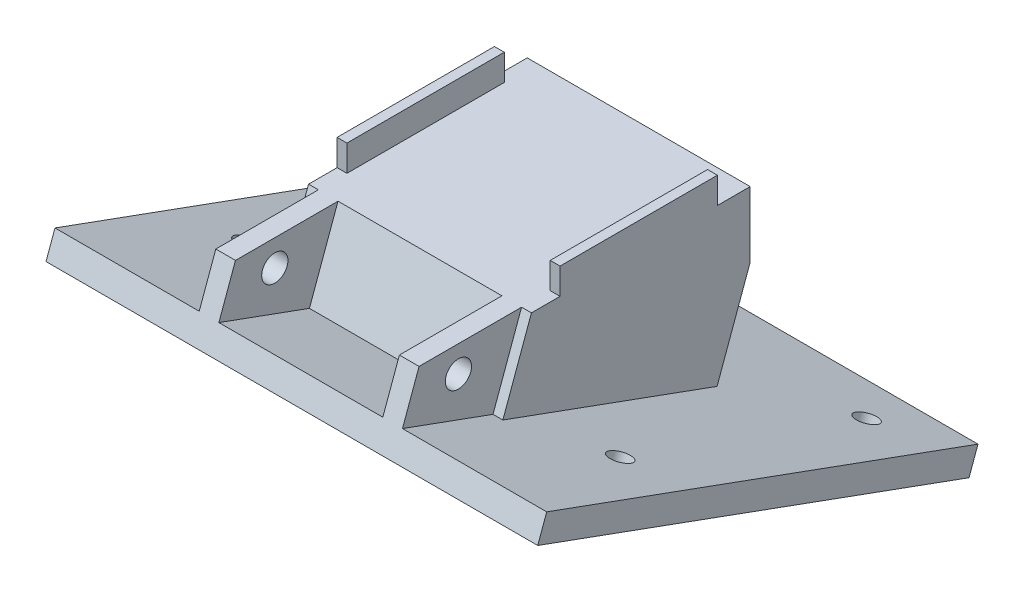
ISO-10303-21;
HEADER;
FILE_DESCRIPTION(('STEP AP214'),'2;1');
FILE_NAME('part.step','',(''),(''),'','','');
FILE_SCHEMA(('AUTOMOTIVE_DESIGN { 1 0 10303 214 1 1 1 1 }'));
ENDSEC;
DATA;
#1=APPLICATION_CONTEXT('core data for automotive mechanical design processes');
#2=APPLICATION_PROTOCOL_DEFINITION('international standard','automotive_design',2000,#1);
#3=PRODUCT_CONTEXT('',#1,'mechanical');
#4=PRODUCT('Part','Part','',(#3));
#5=PRODUCT_RELATED_PRODUCT_CATEGORY('part','',(#4));
#6=PRODUCT_DEFINITION_FORMATION('','',#4);
#7=PRODUCT_DEFINITION_CONTEXT('part definition',#1,'design');
#8=PRODUCT_DEFINITION('design','',#6,#7);
#9=PRODUCT_DEFINITION_SHAPE('','',#8);
#10=(LENGTH_UNIT() NAMED_UNIT(*) SI_UNIT(.MILLI.,.METRE.));
#11=(NAMED_UNIT(*) PLANE_ANGLE_UNIT() SI_UNIT($,.RADIAN.));
#12=(NAMED_UNIT(*) SI_UNIT($,.STERADIAN.) SOLID_ANGLE_UNIT());
#13=UNCERTAINTY_MEASURE_WITH_UNIT(LENGTH_MEASURE(1.E-05),#10,'distance_accuracy_value','');
#14=(GEOMETRIC_REPRESENTATION_CONTEXT(3) GLOBAL_UNCERTAINTY_ASSIGNED_CONTEXT((#13)) GLOBAL_UNIT_ASSIGNED_CONTEXT((#10,
#11,#12)) REPRESENTATION_CONTEXT('',''));
#15=CARTESIAN_POINT('',(0.,0.,0.));
#16=DIRECTION('',(0.,0.,1.));
#17=DIRECTION('',(1.,0.,0.));
#18=AXIS2_PLACEMENT_3D('',#15,#16,#17);
#19=CARTESIAN_POINT('',(-12.5,-28.1780056072107,24.5));
#20=DIRECTION('',(-1.,0.,0.));
#21=DIRECTION('',(0.,0.,1.));
#22=AXIS2_PLACEMENT_3D('',#19,#20,#21);
#23=PLANE('',#22);
#24=CARTESIAN_POINT('',(-12.5,6.,18.5));
#25=DIRECTION('',(-1.,0.,0.));
#26=DIRECTION('',(0.,0.,1.));
#27=AXIS2_PLACEMENT_3D('',#24,#25,#26);
#28=CIRCLE('',#27,2.);
#29=CARTESIAN_POINT('',(-12.5,6.,20.5));
#30=VERTEX_POINT('',#29);
#31=EDGE_CURVE('E307',#30,#30,#28,.T.);
#32=ORIENTED_EDGE('',*,*,#31,.T.);
#33=EDGE_LOOP('',(#32));
#34=FACE_BOUND('',#33,.T.);
#35=DIRECTION('',(0.,0.342020143325669,0.939692620785908));
#36=VECTOR('',#35,1.);
#37=CARTESIAN_POINT('',(-12.5,-1.41681525524397,14.7597232783522));
#38=LINE('',#37,#36);
#39=CARTESIAN_POINT('',(-12.5,-1.97734041654742,13.2196930546348));
#40=VERTEX_POINT('',#39);
#41=CARTESIAN_POINT('',(-12.5,3.04916302597692,27.0298977617813));
#42=VERTEX_POINT('',#41);
#43=EDGE_CURVE('E257',#40,#42,#38,.T.);
#44=ORIENTED_EDGE('',*,*,#43,.F.);
#45=DIRECTION('',(0.,-0.939692620785907,0.342020143325672));
#46=VECTOR('',#45,1.);
#47=CARTESIAN_POINT('',(-12.5,-3.85672565811916,13.9037333412861));
#48=LINE('',#47,#46);
#49=CARTESIAN_POINT('',(-12.5,10.,8.86029765733793));
#50=VERTEX_POINT('',#49);
#51=EDGE_CURVE('E269',#50,#40,#48,.T.);
#52=ORIENTED_EDGE('',*,*,#51,.F.);
#53=DIRECTION('',(0.,0.,1.));
#54=VECTOR('',#53,1.);
#55=CARTESIAN_POINT('',(-12.5,10.,24.5));
#56=LINE('',#55,#54);
#57=CARTESIAN_POINT('',(-12.5,10.,24.5));
#58=VERTEX_POINT('',#57);
#59=EDGE_CURVE('E310',#50,#58,#56,.T.);
#60=ORIENTED_EDGE('',*,*,#59,.T.);
#61=DIRECTION('',(0.,0.93969262078591,-0.342020143325663));
#62=VECTOR('',#61,1.);
#63=CARTESIAN_POINT('',(-12.5,10.,24.5));
#64=LINE('',#63,#62);
#65=EDGE_CURVE('E295',#42,#58,#64,.T.);
#66=ORIENTED_EDGE('',*,*,#65,.F.);
#67=EDGE_LOOP('',(#44,#52,#60,#66));
#68=FACE_BOUND('',#67,.T.);
#69=ADVANCED_FACE('F38',(#34,#68),#23,.F.);
#70=CARTESIAN_POINT('',(12.5,-28.1780056072107,24.5));
#71=DIRECTION('',(1.,0.,0.));
#72=DIRECTION('',(0.,0.,-1.));
#73=AXIS2_PLACEMENT_3D('',#70,#71,#72);
#74=PLANE('',#73);
#75=CARTESIAN_POINT('',(12.5,6.,18.5));
#76=DIRECTION('',(1.,0.,0.));
#77=DIRECTION('',(0.,0.,-1.));
#78=AXIS2_PLACEMENT_3D('',#75,#76,#77);
#79=CIRCLE('',#78,2.);
#80=CARTESIAN_POINT('',(12.5,6.,16.5));
#81=VERTEX_POINT('',#80);
#82=EDGE_CURVE('E304',#81,#81,#79,.T.);
#83=ORIENTED_EDGE('',*,*,#82,.T.);
#84=EDGE_LOOP('',(#83));
#85=FACE_BOUND('',#84,.T.);
#86=DIRECTION('',(0.,-0.342020143325669,-0.939692620785908));
#87=VECTOR('',#86,1.);
#88=CARTESIAN_POINT('',(12.5,-1.41681525524397,14.7597232783522));
#89=LINE('',#88,#87);
#90=CARTESIAN_POINT('',(12.5,3.04916302597692,27.0298977617813));
#91=VERTEX_POINT('',#90);
#92=CARTESIAN_POINT('',(12.5,-1.97734041654742,13.2196930546348));
#93=VERTEX_POINT('',#92);
#94=EDGE_CURVE('E255',#91,#93,#89,.T.);
#95=ORIENTED_EDGE('',*,*,#94,.F.);
#96=DIRECTION('',(0.,-0.93969262078591,0.342020143325663));
#97=VECTOR('',#96,1.);
#98=CARTESIAN_POINT('',(12.5,10.,24.5));
#99=LINE('',#98,#97);
#100=CARTESIAN_POINT('',(12.5,10.,24.5));
#101=VERTEX_POINT('',#100);
#102=EDGE_CURVE('E289',#101,#91,#99,.T.);
#103=ORIENTED_EDGE('',*,*,#102,.F.);
#104=DIRECTION('',(0.,0.,-1.));
#105=VECTOR('',#104,1.);
#106=CARTESIAN_POINT('',(12.5,10.,24.5));
#107=LINE('',#106,#105);
#108=CARTESIAN_POINT('',(12.5,10.,8.86029765733793));
#109=VERTEX_POINT('',#108);
#110=EDGE_CURVE('E317',#101,#109,#107,.T.);
#111=ORIENTED_EDGE('',*,*,#110,.T.);
#112=DIRECTION('',(0.,0.939692620785907,-0.342020143325672));
#113=VECTOR('',#112,1.);
#114=CARTESIAN_POINT('',(12.5,-3.85672565811916,13.9037333412861));
#115=LINE('',#114,#113);
#116=EDGE_CURVE('E285',#93,#109,#115,.T.);
#117=ORIENTED_EDGE('',*,*,#116,.F.);
#118=EDGE_LOOP('',(#95,#103,#111,#117));
#119=FACE_BOUND('',#118,.T.);
#120=ADVANCED_FACE('F521',(#85,#119),#74,.F.);
#121=CARTESIAN_POINT('',(-58.5072954458168,0.,12.5));
#122=DIRECTION('',(0.,0.342020143325672,0.939692620785907));
#123=DIRECTION('',(0.,-0.939692620785907,0.342020143325672));
#124=AXIS2_PLACEMENT_3D('',#121,#122,#123);
#125=PLANE('',#124);
#126=ORIENTED_EDGE('',*,*,#51,.T.);
#127=DIRECTION('',(1.,0.,0.));
#128=VECTOR('',#127,1.);
#129=CARTESIAN_POINT('',(-58.5072954458168,-1.97734041654742,13.2196930546348));
#130=LINE('',#129,#128);
#131=EDGE_CURVE('E252',#40,#93,#130,.T.);
#132=ORIENTED_EDGE('',*,*,#131,.T.);
#133=ORIENTED_EDGE('',*,*,#116,.T.);
#134=DIRECTION('',(-1.,0.,0.));
#135=VECTOR('',#134,1.);
#136=CARTESIAN_POINT('',(20.2179733245961,10.,8.86029765733793));
#137=LINE('',#136,#135);
#138=EDGE_CURVE('E259',#109,#50,#137,.T.);
#139=ORIENTED_EDGE('',*,*,#138,.T.);
#140=EDGE_LOOP('',(#126,#132,#133,#139));
#141=FACE_BOUND('',#140,.T.);
#142=ADVANCED_FACE('F528',(#141),#125,.T.);
#143=CARTESIAN_POINT('',(-17.,10.,24.5));
#144=DIRECTION('',(1.,0.,0.));
#145=DIRECTION('',(0.,0.,-1.));
#146=AXIS2_PLACEMENT_3D('',#143,#144,#145);
#147=PLANE('',#146);
#148=DIRECTION('',(0.,-0.342020143325669,-0.939692620785908));
#149=VECTOR('',#148,1.);
#150=CARTESIAN_POINT('',(-17.,3.04916302597693,27.0298977617814));
#151=LINE('',#150,#149);
#152=CARTESIAN_POINT('',(-17.,-1.97734041654742,13.2196930546348));
#153=VERTEX_POINT('',#152);
#154=CARTESIAN_POINT('',(-17.,-13.8689111957484,-19.4521291430663));
#155=VERTEX_POINT('',#154);
#156=EDGE_CURVE('E53',#153,#155,#151,.T.);
#157=ORIENTED_EDGE('',*,*,#156,.F.);
#158=DIRECTION('',(0.,0.939692620785907,-0.342020143325672));
#159=VECTOR('',#158,1.);
#160=CARTESIAN_POINT('',(-17.,0.,12.5));
#161=LINE('',#160,#159);
#162=CARTESIAN_POINT('',(-17.,10.,8.86029765733793));
#163=VERTEX_POINT('',#162);
#164=EDGE_CURVE('E278',#153,#163,#161,.T.);
#165=ORIENTED_EDGE('',*,*,#164,.T.);
#166=DIRECTION('',(0.,0.,1.));
#167=VECTOR('',#166,1.);
#168=CARTESIAN_POINT('',(-17.,10.,24.5));
#169=LINE('',#168,#167);
#170=CARTESIAN_POINT('',(-17.,10.,4.5));
#171=VERTEX_POINT('',#170);
#172=EDGE_CURVE('E379',#171,#163,#169,.T.);
#173=ORIENTED_EDGE('',*,*,#172,.F.);
#174=DIRECTION('',(0.,-1.,0.));
#175=VECTOR('',#174,1.);
#176=CARTESIAN_POINT('',(-17.,14.,4.5));
#177=LINE('',#176,#175);
#178=CARTESIAN_POINT('',(-17.,14.,4.5));
#179=VERTEX_POINT('',#178);
#180=EDGE_CURVE('E372',#179,#171,#177,.T.);
#181=ORIENTED_EDGE('',*,*,#180,.F.);
#182=DIRECTION('',(0.,0.,1.));
#183=VECTOR('',#182,1.);
#184=CARTESIAN_POINT('',(-17.,14.,-19.5));
#185=LINE('',#184,#183);
#186=CARTESIAN_POINT('',(-17.,14.,-19.5));
#187=VERTEX_POINT('',#186);
#188=EDGE_CURVE('E346',#187,#179,#185,.T.);
#189=ORIENTED_EDGE('',*,*,#188,.F.);
#190=DIRECTION('',(0.,-1.,0.));
#191=VECTOR('',#190,1.);
#192=CARTESIAN_POINT('',(-17.,14.,-19.5));
#193=LINE('',#192,#191);
#194=CARTESIAN_POINT('',(-17.,10.,-19.5));
#195=VERTEX_POINT('',#194);
#196=EDGE_CURVE('E356',#187,#195,#193,.T.);
#197=ORIENTED_EDGE('',*,*,#196,.T.);
#198=CARTESIAN_POINT('',(-17.,10.,-24.5));
#199=VERTEX_POINT('',#198);
#200=EDGE_CURVE('E376',#199,#195,#169,.T.);
#201=ORIENTED_EDGE('',*,*,#200,.F.);
#202=DIRECTION('',(0.,-1.,0.));
#203=VECTOR('',#202,1.);
#204=CARTESIAN_POINT('',(-17.,10.,-24.5));
#205=LINE('',#204,#203);
#206=CARTESIAN_POINT('',(-17.,0.,-24.5));
#207=VERTEX_POINT('',#206);
#208=EDGE_CURVE('E387',#199,#207,#205,.T.);
#209=ORIENTED_EDGE('',*,*,#208,.T.);
#210=DIRECTION('',(0.,-0.93969262078591,0.342020143325666));
#211=VECTOR('',#210,1.);
#212=CARTESIAN_POINT('',(-17.,-15.7482964373202,-18.768088856415));
#213=LINE('',#212,#211);
#214=EDGE_CURVE('E275',#207,#155,#213,.T.);
#215=ORIENTED_EDGE('',*,*,#214,.T.);
#216=EDGE_LOOP('',(#157,#165,#173,#181,#189,#197,#201,#209,#215));
#217=FACE_BOUND('',#216,.T.);
#218=ADVANCED_FACE('F40',(#217),#147,.F.);
#219=CARTESIAN_POINT('',(17.,10.,24.5));
#220=DIRECTION('',(-1.,0.,0.));
#221=DIRECTION('',(0.,0.,1.));
#222=AXIS2_PLACEMENT_3D('',#219,#220,#221);
#223=PLANE('',#222);
#224=DIRECTION('',(0.,0.342020143325669,0.939692620785908));
#225=VECTOR('',#224,1.);
#226=CARTESIAN_POINT('',(17.,3.04916302597693,27.0298977617814));
#227=LINE('',#226,#225);
#228=CARTESIAN_POINT('',(17.,-13.8689111957484,-19.4521291430663));
#229=VERTEX_POINT('',#228);
#230=CARTESIAN_POINT('',(17.,-1.97734041654742,13.2196930546348));
#231=VERTEX_POINT('',#230);
#232=EDGE_CURVE('E234',#229,#231,#227,.T.);
#233=ORIENTED_EDGE('',*,*,#232,.F.);
#234=DIRECTION('',(0.,0.939692620785909,-0.342020143325666));
#235=VECTOR('',#234,1.);
#236=CARTESIAN_POINT('',(17.,-15.7482964373202,-18.768088856415));
#237=LINE('',#236,#235);
#238=CARTESIAN_POINT('',(17.,0.,-24.5));
#239=VERTEX_POINT('',#238);
#240=EDGE_CURVE('E279',#229,#239,#237,.T.);
#241=ORIENTED_EDGE('',*,*,#240,.T.);
#242=DIRECTION('',(0.,-1.,0.));
#243=VECTOR('',#242,1.);
#244=CARTESIAN_POINT('',(17.,10.,-24.5));
#245=LINE('',#244,#243);
#246=CARTESIAN_POINT('',(17.,10.,-24.5));
#247=VERTEX_POINT('',#246);
#248=EDGE_CURVE('E46',#247,#239,#245,.T.);
#249=ORIENTED_EDGE('',*,*,#248,.F.);
#250=DIRECTION('',(0.,0.,-1.));
#251=VECTOR('',#250,1.);
#252=CARTESIAN_POINT('',(17.,10.,24.5));
#253=LINE('',#252,#251);
#254=CARTESIAN_POINT('',(17.,10.,-19.5));
#255=VERTEX_POINT('',#254);
#256=EDGE_CURVE('E385',#255,#247,#253,.T.);
#257=ORIENTED_EDGE('',*,*,#256,.F.);
#258=DIRECTION('',(0.,-1.,0.));
#259=VECTOR('',#258,1.);
#260=CARTESIAN_POINT('',(17.,14.,-19.5));
#261=LINE('',#260,#259);
#262=CARTESIAN_POINT('',(17.,14.,-19.5));
#263=VERTEX_POINT('',#262);
#264=EDGE_CURVE('E343',#263,#255,#261,.T.);
#265=ORIENTED_EDGE('',*,*,#264,.F.);
#266=DIRECTION('',(0.,0.,-1.));
#267=VECTOR('',#266,1.);
#268=CARTESIAN_POINT('',(17.,14.,-19.5));
#269=LINE('',#268,#267);
#270=CARTESIAN_POINT('',(17.,14.,4.5));
#271=VERTEX_POINT('',#270);
#272=EDGE_CURVE('E322',#271,#263,#269,.T.);
#273=ORIENTED_EDGE('',*,*,#272,.F.);
#274=DIRECTION('',(0.,-1.,0.));
#275=VECTOR('',#274,1.);
#276=CARTESIAN_POINT('',(17.,14.,4.5));
#277=LINE('',#276,#275);
#278=CARTESIAN_POINT('',(17.,10.,4.5));
#279=VERTEX_POINT('',#278);
#280=EDGE_CURVE('E332',#271,#279,#277,.T.);
#281=ORIENTED_EDGE('',*,*,#280,.T.);
#282=CARTESIAN_POINT('',(17.,10.,8.86029765733793));
#283=VERTEX_POINT('',#282);
#284=EDGE_CURVE('E382',#283,#279,#253,.T.);
#285=ORIENTED_EDGE('',*,*,#284,.F.);
#286=DIRECTION('',(0.,-0.939692620785907,0.342020143325672));
#287=VECTOR('',#286,1.);
#288=CARTESIAN_POINT('',(17.,0.,12.5));
#289=LINE('',#288,#287);
#290=EDGE_CURVE('E272',#283,#231,#289,.T.);
#291=ORIENTED_EDGE('',*,*,#290,.T.);
#292=EDGE_LOOP('',(#233,#241,#249,#257,#265,#273,#281,#285,#291));
#293=FACE_BOUND('',#292,.T.);
#294=ADVANCED_FACE('F401',(#293),#223,.F.);
#295=CARTESIAN_POINT('',(15.5,-28.1780056072107,24.5));
#296=DIRECTION('',(-1.,0.,0.));
#297=DIRECTION('',(0.,0.,1.));
#298=AXIS2_PLACEMENT_3D('',#295,#296,#297);
#299=PLANE('',#298);
#300=CARTESIAN_POINT('',(15.5,6.,18.5));
#301=DIRECTION('',(-1.,0.,0.));
#302=DIRECTION('',(0.,0.,1.));
#303=AXIS2_PLACEMENT_3D('',#300,#301,#302);
#304=CIRCLE('',#303,2.);
#305=CARTESIAN_POINT('',(15.5,6.,20.5));
#306=VERTEX_POINT('',#305);
#307=EDGE_CURVE('E301',#306,#306,#304,.F.);
#308=ORIENTED_EDGE('',*,*,#307,.F.);
#309=EDGE_LOOP('',(#308));
#310=FACE_BOUND('',#309,.T.);
#311=DIRECTION('',(0.,0.342020143325669,0.939692620785908));
#312=VECTOR('',#311,1.);
#313=CARTESIAN_POINT('',(15.5,-1.41681525524397,14.7597232783522));
#314=LINE('',#313,#312);
#315=CARTESIAN_POINT('',(15.5,-1.97734041654742,13.2196930546348));
#316=VERTEX_POINT('',#315);
#317=CARTESIAN_POINT('',(15.5,3.04916302597692,27.0298977617813));
#318=VERTEX_POINT('',#317);
#319=EDGE_CURVE('E250',#316,#318,#314,.T.);
#320=ORIENTED_EDGE('',*,*,#319,.F.);
#321=DIRECTION('',(0.,0.939692620785907,-0.342020143325672));
#322=VECTOR('',#321,1.);
#323=CARTESIAN_POINT('',(15.5,-3.85672565811916,13.9037333412861));
#324=LINE('',#323,#322);
#325=CARTESIAN_POINT('',(15.5,10.,8.86029765733793));
#326=VERTEX_POINT('',#325);
#327=EDGE_CURVE('E284',#316,#326,#324,.T.);
#328=ORIENTED_EDGE('',*,*,#327,.T.);
#329=DIRECTION('',(0.,0.,1.));
#330=VECTOR('',#329,1.);
#331=CARTESIAN_POINT('',(15.5,10.,24.5));
#332=LINE('',#331,#330);
#333=CARTESIAN_POINT('',(15.5,10.,24.5));
#334=VERTEX_POINT('',#333);
#335=EDGE_CURVE('E314',#326,#334,#332,.T.);
#336=ORIENTED_EDGE('',*,*,#335,.T.);
#337=DIRECTION('',(0.,-0.93969262078591,0.342020143325663));
#338=VECTOR('',#337,1.);
#339=CARTESIAN_POINT('',(15.5,10.,24.5));
#340=LINE('',#339,#338);
#341=EDGE_CURVE('E287',#334,#318,#340,.T.);
#342=ORIENTED_EDGE('',*,*,#341,.T.);
#343=EDGE_LOOP('',(#320,#328,#336,#342));
#344=FACE_BOUND('',#343,.T.);
#345=ADVANCED_FACE('F462',(#310,#344),#299,.F.);
#346=CARTESIAN_POINT('',(-15.5,-28.1780056072107,24.5));
#347=DIRECTION('',(1.,0.,0.));
#348=DIRECTION('',(0.,0.,-1.));
#349=AXIS2_PLACEMENT_3D('',#346,#347,#348);
#350=PLANE('',#349);
#351=CARTESIAN_POINT('',(-15.5,6.,18.5));
#352=DIRECTION('',(-1.,0.,0.));
#353=DIRECTION('',(0.,0.,1.));
#354=AXIS2_PLACEMENT_3D('',#351,#352,#353);
#355=CIRCLE('',#354,2.);
#356=CARTESIAN_POINT('',(-15.5,6.,20.5));
#357=VERTEX_POINT('',#356);
#358=EDGE_CURVE('E297',#357,#357,#355,.T.);
#359=ORIENTED_EDGE('',*,*,#358,.F.);
#360=EDGE_LOOP('',(#359));
#361=FACE_BOUND('',#360,.T.);
#362=DIRECTION('',(0.,-0.342020143325669,-0.939692620785908));
#363=VECTOR('',#362,1.);
#364=CARTESIAN_POINT('',(-15.5,-1.41681525524397,14.7597232783522));
#365=LINE('',#364,#363);
#366=CARTESIAN_POINT('',(-15.5,3.04916302597692,27.0298977617813));
#367=VERTEX_POINT('',#366);
#368=CARTESIAN_POINT('',(-15.5,-1.97734041654742,13.2196930546348));
#369=VERTEX_POINT('',#368);
#370=EDGE_CURVE('E248',#367,#369,#365,.T.);
#371=ORIENTED_EDGE('',*,*,#370,.F.);
#372=DIRECTION('',(0.,0.93969262078591,-0.342020143325663));
#373=VECTOR('',#372,1.);
#374=CARTESIAN_POINT('',(-15.5,10.,24.5));
#375=LINE('',#374,#373);
#376=CARTESIAN_POINT('',(-15.5,10.,24.5));
#377=VERTEX_POINT('',#376);
#378=EDGE_CURVE('E292',#367,#377,#375,.T.);
#379=ORIENTED_EDGE('',*,*,#378,.T.);
#380=DIRECTION('',(0.,0.,-1.));
#381=VECTOR('',#380,1.);
#382=CARTESIAN_POINT('',(-15.5,10.,24.5));
#383=LINE('',#382,#381);
#384=CARTESIAN_POINT('',(-15.5,10.,8.86029765733793));
#385=VERTEX_POINT('',#384);
#386=EDGE_CURVE('E311',#377,#385,#383,.T.);
#387=ORIENTED_EDGE('',*,*,#386,.T.);
#388=DIRECTION('',(0.,-0.939692620785907,0.342020143325672));
#389=VECTOR('',#388,1.);
#390=CARTESIAN_POINT('',(-15.5,-3.85672565811916,13.9037333412861));
#391=LINE('',#390,#389);
#392=EDGE_CURVE('E268',#385,#369,#391,.T.);
#393=ORIENTED_EDGE('',*,*,#392,.T.);
#394=EDGE_LOOP('',(#371,#379,#387,#393));
#395=FACE_BOUND('',#394,.T.);
#396=ADVANCED_FACE('F435',(#361,#395),#350,.F.);
#397=ORIENTED_EDGE('',*,*,#164,.F.);
#398=DIRECTION('',(1.,0.,0.));
#399=VECTOR('',#398,1.);
#400=CARTESIAN_POINT('',(-58.5072954458168,-1.97734041654742,13.2196930546348));
#401=LINE('',#400,#399);
#402=EDGE_CURVE('E245',#153,#369,#401,.T.);
#403=ORIENTED_EDGE('',*,*,#402,.T.);
#404=ORIENTED_EDGE('',*,*,#392,.F.);
#405=DIRECTION('',(-1.,0.,0.));
#406=VECTOR('',#405,1.);
#407=CARTESIAN_POINT('',(-4.85822227524087,10.,8.86029765733793));
#408=LINE('',#407,#406);
#409=EDGE_CURVE('E262',#385,#163,#408,.T.);
#410=ORIENTED_EDGE('',*,*,#409,.T.);
#411=EDGE_LOOP('',(#397,#403,#404,#410));
#412=FACE_BOUND('',#411,.T.);
#413=ADVANCED_FACE('F432',(#412),#125,.T.);
#414=ORIENTED_EDGE('',*,*,#327,.F.);
#415=DIRECTION('',(1.,0.,0.));
#416=VECTOR('',#415,1.);
#417=CARTESIAN_POINT('',(-58.5072954458168,-1.97734041654742,13.2196930546348));
#418=LINE('',#417,#416);
#419=EDGE_CURVE('E242',#316,#231,#418,.T.);
#420=ORIENTED_EDGE('',*,*,#419,.T.);
#421=ORIENTED_EDGE('',*,*,#290,.F.);
#422=DIRECTION('',(1.,0.,0.));
#423=VECTOR('',#422,1.);
#424=CARTESIAN_POINT('',(4.85822227524088,10.,8.86029765733793));
#425=LINE('',#424,#423);
#426=EDGE_CURVE('E265',#326,#283,#425,.T.);
#427=ORIENTED_EDGE('',*,*,#426,.F.);
#428=EDGE_LOOP('',(#414,#420,#421,#427));
#429=FACE_BOUND('',#428,.T.);
#430=ADVANCED_FACE('F458',(#429),#125,.T.);
#431=CARTESIAN_POINT('',(-58.5072954458168,-15.7482964373202,-18.768088856415));
#432=DIRECTION('',(0.,-0.342020143325666,-0.93969262078591));
#433=DIRECTION('',(0.,0.93969262078591,-0.342020143325666));
#434=AXIS2_PLACEMENT_3D('',#431,#432,#433);
#435=PLANE('',#434);
#436=ORIENTED_EDGE('',*,*,#240,.F.);
#437=DIRECTION('',(-1.,0.,0.));
#438=VECTOR('',#437,1.);
#439=CARTESIAN_POINT('',(-58.5072954458168,-13.8689111957484,-19.4521291430663));
#440=LINE('',#439,#438);
#441=EDGE_CURVE('E11',#229,#155,#440,.T.);
#442=ORIENTED_EDGE('',*,*,#441,.T.);
#443=ORIENTED_EDGE('',*,*,#214,.F.);
#444=DIRECTION('',(-1.,0.,0.));
#445=VECTOR('',#444,1.);
#446=CARTESIAN_POINT('',(17.,0.,-24.5));
#447=LINE('',#446,#445);
#448=EDGE_CURVE('E375',#239,#207,#447,.T.);
#449=ORIENTED_EDGE('',*,*,#448,.F.);
#450=EDGE_LOOP('',(#436,#442,#443,#449));
#451=FACE_BOUND('',#450,.T.);
#452=ADVANCED_FACE('F405',(#451),#435,.T.);
#453=CARTESIAN_POINT('',(0.,10.,0.));
#454=DIRECTION('',(0.,1.,0.));
#455=DIRECTION('',(0.,0.,1.));
#456=AXIS2_PLACEMENT_3D('',#453,#454,#455);
#457=PLANE('',#456);
#458=ORIENTED_EDGE('',*,*,#59,.F.);
#459=ORIENTED_EDGE('',*,*,#138,.F.);
#460=ORIENTED_EDGE('',*,*,#110,.F.);
#461=DIRECTION('',(1.,0.,0.));
#462=VECTOR('',#461,1.);
#463=CARTESIAN_POINT('',(17.,10.,24.5));
#464=LINE('',#463,#462);
#465=EDGE_CURVE('E378',#101,#334,#464,.T.);
#466=ORIENTED_EDGE('',*,*,#465,.T.);
#467=ORIENTED_EDGE('',*,*,#335,.F.);
#468=ORIENTED_EDGE('',*,*,#426,.T.);
#469=ORIENTED_EDGE('',*,*,#284,.T.);
#470=DIRECTION('',(1.,0.,0.));
#471=VECTOR('',#470,1.);
#472=CARTESIAN_POINT('',(17.,10.,4.5));
#473=LINE('',#472,#471);
#474=CARTESIAN_POINT('',(15.5,10.,4.5));
#475=VERTEX_POINT('',#474);
#476=EDGE_CURVE('E326',#475,#279,#473,.T.);
#477=ORIENTED_EDGE('',*,*,#476,.F.);
#478=DIRECTION('',(0.,0.,1.));
#479=VECTOR('',#478,1.);
#480=CARTESIAN_POINT('',(15.5,10.,-19.5));
#481=LINE('',#480,#479);
#482=CARTESIAN_POINT('',(15.5,10.,-19.5));
#483=VERTEX_POINT('',#482);
#484=EDGE_CURVE('E334',#483,#475,#481,.T.);
#485=ORIENTED_EDGE('',*,*,#484,.F.);
#486=DIRECTION('',(-1.,0.,0.));
#487=VECTOR('',#486,1.);
#488=CARTESIAN_POINT('',(17.,10.,-19.5));
#489=LINE('',#488,#487);
#490=EDGE_CURVE('E313',#255,#483,#489,.T.);
#491=ORIENTED_EDGE('',*,*,#490,.F.);
#492=ORIENTED_EDGE('',*,*,#256,.T.);
#493=DIRECTION('',(-1.,0.,0.));
#494=VECTOR('',#493,1.);
#495=CARTESIAN_POINT('',(17.,10.,-24.5));
#496=LINE('',#495,#494);
#497=EDGE_CURVE('E384',#247,#199,#496,.T.);
#498=ORIENTED_EDGE('',*,*,#497,.T.);
#499=ORIENTED_EDGE('',*,*,#200,.T.);
#500=DIRECTION('',(-1.,0.,0.));
#501=VECTOR('',#500,1.);
#502=CARTESIAN_POINT('',(-17.,10.,-19.5));
#503=LINE('',#502,#501);
#504=CARTESIAN_POINT('',(-15.5,10.,-19.5));
#505=VERTEX_POINT('',#504);
#506=EDGE_CURVE('E350',#505,#195,#503,.T.);
#507=ORIENTED_EDGE('',*,*,#506,.F.);
#508=DIRECTION('',(0.,0.,-1.));
#509=VECTOR('',#508,1.);
#510=CARTESIAN_POINT('',(-15.5,10.,-19.5));
#511=LINE('',#510,#509);
#512=CARTESIAN_POINT('',(-15.5,10.,4.5));
#513=VERTEX_POINT('',#512);
#514=EDGE_CURVE('E359',#513,#505,#511,.T.);
#515=ORIENTED_EDGE('',*,*,#514,.F.);
#516=DIRECTION('',(1.,0.,0.));
#517=VECTOR('',#516,1.);
#518=CARTESIAN_POINT('',(-17.,10.,4.5));
#519=LINE('',#518,#517);
#520=EDGE_CURVE('E345',#171,#513,#519,.T.);
#521=ORIENTED_EDGE('',*,*,#520,.F.);
#522=ORIENTED_EDGE('',*,*,#172,.T.);
#523=ORIENTED_EDGE('',*,*,#409,.F.);
#524=ORIENTED_EDGE('',*,*,#386,.F.);
#525=EDGE_CURVE('E381',#377,#58,#464,.T.);
#526=ORIENTED_EDGE('',*,*,#525,.T.);
#527=EDGE_LOOP('',(#458,#459,#460,#466,#467,#468,#469,#477,#485,#491,#492,#498,#499,#507,#515,
#521,#522,#523,#524,#526));
#528=FACE_BOUND('',#527,.T.);
#529=ADVANCED_FACE('F413',(#528),#457,.T.);
#530=CARTESIAN_POINT('',(17.,10.,-24.5));
#531=DIRECTION('',(0.,0.,1.));
#532=DIRECTION('',(1.,0.,0.));
#533=AXIS2_PLACEMENT_3D('',#530,#531,#532);
#534=PLANE('',#533);
#535=ORIENTED_EDGE('',*,*,#448,.T.);
#536=ORIENTED_EDGE('',*,*,#208,.F.);
#537=ORIENTED_EDGE('',*,*,#497,.F.);
#538=ORIENTED_EDGE('',*,*,#248,.T.);
#539=EDGE_LOOP('',(#535,#536,#537,#538));
#540=FACE_BOUND('',#539,.T.);
#541=ADVANCED_FACE('F395',(#540),#534,.F.);
#542=CARTESIAN_POINT('',(-17.,14.,4.5));
#543=DIRECTION('',(0.,0.,-1.));
#544=DIRECTION('',(-1.,0.,0.));
#545=AXIS2_PLACEMENT_3D('',#542,#543,#544);
#546=PLANE('',#545);
#547=ORIENTED_EDGE('',*,*,#520,.T.);
#548=DIRECTION('',(0.,-1.,0.));
#549=VECTOR('',#548,1.);
#550=CARTESIAN_POINT('',(-15.5,14.,4.5));
#551=LINE('',#550,#549);
#552=CARTESIAN_POINT('',(-15.5,14.,4.5));
#553=VERTEX_POINT('',#552);
#554=EDGE_CURVE('E369',#553,#513,#551,.T.);
#555=ORIENTED_EDGE('',*,*,#554,.F.);
#556=DIRECTION('',(1.,0.,0.));
#557=VECTOR('',#556,1.);
#558=CARTESIAN_POINT('',(-17.,14.,4.5));
#559=LINE('',#558,#557);
#560=EDGE_CURVE('E349',#179,#553,#559,.T.);
#561=ORIENTED_EDGE('',*,*,#560,.F.);
#562=ORIENTED_EDGE('',*,*,#180,.T.);
#563=EDGE_LOOP('',(#547,#555,#561,#562));
#564=FACE_BOUND('',#563,.T.);
#565=ADVANCED_FACE('F425',(#564),#546,.F.);
#566=CARTESIAN_POINT('',(-15.5,14.,-19.5));
#567=DIRECTION('',(-1.,0.,0.));
#568=DIRECTION('',(0.,0.,1.));
#569=AXIS2_PLACEMENT_3D('',#566,#567,#568);
#570=PLANE('',#569);
#571=ORIENTED_EDGE('',*,*,#514,.T.);
#572=DIRECTION('',(0.,-1.,0.));
#573=VECTOR('',#572,1.);
#574=CARTESIAN_POINT('',(-15.5,14.,-19.5));
#575=LINE('',#574,#573);
#576=CARTESIAN_POINT('',(-15.5,14.,-19.5));
#577=VERTEX_POINT('',#576);
#578=EDGE_CURVE('E366',#577,#505,#575,.T.);
#579=ORIENTED_EDGE('',*,*,#578,.F.);
#580=DIRECTION('',(0.,0.,-1.));
#581=VECTOR('',#580,1.);
#582=CARTESIAN_POINT('',(-15.5,14.,-19.5));
#583=LINE('',#582,#581);
#584=EDGE_CURVE('E352',#553,#577,#583,.T.);
#585=ORIENTED_EDGE('',*,*,#584,.F.);
#586=ORIENTED_EDGE('',*,*,#554,.T.);
#587=EDGE_LOOP('',(#571,#579,#585,#586));
#588=FACE_BOUND('',#587,.T.);
#589=ADVANCED_FACE('F420',(#588),#570,.F.);
#590=CARTESIAN_POINT('',(-17.,14.,-19.5));
#591=DIRECTION('',(0.,0.,1.));
#592=DIRECTION('',(1.,0.,0.));
#593=AXIS2_PLACEMENT_3D('',#590,#591,#592);
#594=PLANE('',#593);
#595=ORIENTED_EDGE('',*,*,#506,.T.);
#596=ORIENTED_EDGE('',*,*,#196,.F.);
#597=DIRECTION('',(-1.,0.,0.));
#598=VECTOR('',#597,1.);
#599=CARTESIAN_POINT('',(-17.,14.,-19.5));
#600=LINE('',#599,#598);
#601=EDGE_CURVE('E354',#577,#187,#600,.T.);
#602=ORIENTED_EDGE('',*,*,#601,.F.);
#603=ORIENTED_EDGE('',*,*,#578,.T.);
#604=EDGE_LOOP('',(#595,#596,#602,#603));
#605=FACE_BOUND('',#604,.T.);
#606=ADVANCED_FACE('F415',(#605),#594,.F.);
#607=CARTESIAN_POINT('',(0.,14.,0.));
#608=DIRECTION('',(0.,1.,0.));
#609=DIRECTION('',(0.,0.,1.));
#610=AXIS2_PLACEMENT_3D('',#607,#608,#609);
#611=PLANE('',#610);
#612=ORIENTED_EDGE('',*,*,#188,.T.);
#613=ORIENTED_EDGE('',*,*,#560,.T.);
#614=ORIENTED_EDGE('',*,*,#584,.T.);
#615=ORIENTED_EDGE('',*,*,#601,.T.);
#616=EDGE_LOOP('',(#612,#613,#614,#615));
#617=FACE_BOUND('',#616,.T.);
#618=ADVANCED_FACE('F543',(#617),#611,.T.);
#619=CARTESIAN_POINT('',(17.,14.,-19.5));
#620=DIRECTION('',(0.,0.,1.));
#621=DIRECTION('',(1.,0.,0.));
#622=AXIS2_PLACEMENT_3D('',#619,#620,#621);
#623=PLANE('',#622);
#624=ORIENTED_EDGE('',*,*,#490,.T.);
#625=DIRECTION('',(0.,-1.,0.));
#626=VECTOR('',#625,1.);
#627=CARTESIAN_POINT('',(15.5,14.,-19.5));
#628=LINE('',#627,#626);
#629=CARTESIAN_POINT('',(15.5,14.,-19.5));
#630=VERTEX_POINT('',#629);
#631=EDGE_CURVE('E340',#630,#483,#628,.T.);
#632=ORIENTED_EDGE('',*,*,#631,.F.);
#633=DIRECTION('',(-1.,0.,0.));
#634=VECTOR('',#633,1.);
#635=CARTESIAN_POINT('',(17.,14.,-19.5));
#636=LINE('',#635,#634);
#637=EDGE_CURVE('E325',#263,#630,#636,.T.);
#638=ORIENTED_EDGE('',*,*,#637,.F.);
#639=ORIENTED_EDGE('',*,*,#264,.T.);
#640=EDGE_LOOP('',(#624,#632,#638,#639));
#641=FACE_BOUND('',#640,.T.);
#642=ADVANCED_FACE('F444',(#641),#623,.F.);
#643=CARTESIAN_POINT('',(15.5,14.,-19.5));
#644=DIRECTION('',(1.,0.,0.));
#645=DIRECTION('',(0.,0.,-1.));
#646=AXIS2_PLACEMENT_3D('',#643,#644,#645);
#647=PLANE('',#646);
#648=ORIENTED_EDGE('',*,*,#484,.T.);
#649=DIRECTION('',(0.,-1.,0.));
#650=VECTOR('',#649,1.);
#651=CARTESIAN_POINT('',(15.5,14.,4.5));
#652=LINE('',#651,#650);
#653=CARTESIAN_POINT('',(15.5,14.,4.5));
#654=VERTEX_POINT('',#653);
#655=EDGE_CURVE('E60',#654,#475,#652,.T.);
#656=ORIENTED_EDGE('',*,*,#655,.F.);
#657=DIRECTION('',(0.,0.,1.));
#658=VECTOR('',#657,1.);
#659=CARTESIAN_POINT('',(15.5,14.,-19.5));
#660=LINE('',#659,#658);
#661=EDGE_CURVE('E328',#630,#654,#660,.T.);
#662=ORIENTED_EDGE('',*,*,#661,.F.);
#663=ORIENTED_EDGE('',*,*,#631,.T.);
#664=EDGE_LOOP('',(#648,#656,#662,#663));
#665=FACE_BOUND('',#664,.T.);
#666=ADVANCED_FACE('F447',(#665),#647,.F.);
#667=CARTESIAN_POINT('',(17.,14.,4.5));
#668=DIRECTION('',(0.,0.,-1.));
#669=DIRECTION('',(-1.,0.,0.));
#670=AXIS2_PLACEMENT_3D('',#667,#668,#669);
#671=PLANE('',#670);
#672=ORIENTED_EDGE('',*,*,#476,.T.);
#673=ORIENTED_EDGE('',*,*,#280,.F.);
#674=DIRECTION('',(1.,0.,0.));
#675=VECTOR('',#674,1.);
#676=CARTESIAN_POINT('',(17.,14.,4.5));
#677=LINE('',#676,#675);
#678=EDGE_CURVE('E330',#654,#271,#677,.T.);
#679=ORIENTED_EDGE('',*,*,#678,.F.);
#680=ORIENTED_EDGE('',*,*,#655,.T.);
#681=EDGE_LOOP('',(#672,#673,#679,#680));
#682=FACE_BOUND('',#681,.T.);
#683=ADVANCED_FACE('F453',(#682),#671,.F.);
#684=CARTESIAN_POINT('',(0.,14.,0.));
#685=DIRECTION('',(0.,-1.,0.));
#686=DIRECTION('',(0.,0.,-1.));
#687=AXIS2_PLACEMENT_3D('',#684,#685,#686);
#688=PLANE('',#687);
#689=ORIENTED_EDGE('',*,*,#272,.T.);
#690=ORIENTED_EDGE('',*,*,#637,.T.);
#691=ORIENTED_EDGE('',*,*,#661,.T.);
#692=ORIENTED_EDGE('',*,*,#678,.T.);
#693=EDGE_LOOP('',(#689,#690,#691,#692));
#694=FACE_BOUND('',#693,.T.);
#695=ADVANCED_FACE('F449',(#694),#688,.F.);
#696=CARTESIAN_POINT('',(21.1568542494924,6.,18.5));
#697=DIRECTION('',(-1.,0.,0.));
#698=DIRECTION('',(0.,0.,1.));
#699=AXIS2_PLACEMENT_3D('',#696,#697,#698);
#700=CYLINDRICAL_SURFACE('',#699,2.);
#701=ORIENTED_EDGE('',*,*,#358,.T.);
#702=EDGE_LOOP('',(#701));
#703=FACE_BOUND('',#702,.T.);
#704=ORIENTED_EDGE('',*,*,#31,.F.);
#705=EDGE_LOOP('',(#704));
#706=FACE_BOUND('',#705,.T.);
#707=ADVANCED_FACE('F536',(#703,#706),#700,.F.);
#708=ORIENTED_EDGE('',*,*,#307,.T.);
#709=EDGE_LOOP('',(#708));
#710=FACE_BOUND('',#709,.T.);
#711=ORIENTED_EDGE('',*,*,#82,.F.);
#712=EDGE_LOOP('',(#711));
#713=FACE_BOUND('',#712,.T.);
#714=ADVANCED_FACE('F593',(#710,#713),#700,.F.);
#715=CARTESIAN_POINT('',(-12.5,10.,24.5));
#716=DIRECTION('',(0.,0.342020143325663,0.93969262078591));
#717=DIRECTION('',(0.,-0.939692620785911,0.342020143325663));
#718=AXIS2_PLACEMENT_3D('',#715,#716,#717);
#719=PLANE('',#718);
#720=DIRECTION('',(-1.,0.,0.));
#721=VECTOR('',#720,1.);
#722=CARTESIAN_POINT('',(-37.5,3.04916302597692,27.0298977617813));
#723=LINE('',#722,#721);
#724=EDGE_CURVE('E468',#91,#42,#723,.T.);
#725=ORIENTED_EDGE('',*,*,#724,.T.);
#726=ORIENTED_EDGE('',*,*,#65,.T.);
#727=ORIENTED_EDGE('',*,*,#525,.F.);
#728=ORIENTED_EDGE('',*,*,#378,.F.);
#729=CARTESIAN_POINT('',(-37.5,3.04916302597692,27.0298977617813));
#730=VERTEX_POINT('',#729);
#731=EDGE_CURVE('E470',#367,#730,#723,.T.);
#732=ORIENTED_EDGE('',*,*,#731,.T.);
#733=DIRECTION('',(0.,0.939692620785908,-0.342020143325669));
#734=VECTOR('',#733,1.);
#735=CARTESIAN_POINT('',(-37.5,-0.709607457166714,28.397978335084));
#736=LINE('',#735,#734);
#737=CARTESIAN_POINT('',(-37.5,-0.709607457166714,28.397978335084));
#738=VERTEX_POINT('',#737);
#739=EDGE_CURVE('E215',#738,#730,#736,.T.);
#740=ORIENTED_EDGE('',*,*,#739,.F.);
#741=DIRECTION('',(-1.,0.,0.));
#742=VECTOR('',#741,1.);
#743=CARTESIAN_POINT('',(-37.5,-0.709607457166714,28.397978335084));
#744=LINE('',#743,#742);
#745=CARTESIAN_POINT('',(37.5,-0.709607457166714,28.397978335084));
#746=VERTEX_POINT('',#745);
#747=EDGE_CURVE('E206',#746,#738,#744,.T.);
#748=ORIENTED_EDGE('',*,*,#747,.F.);
#749=DIRECTION('',(0.,0.939692620785908,-0.342020143325669));
#750=VECTOR('',#749,1.);
#751=CARTESIAN_POINT('',(37.5,-0.709607457166714,28.397978335084));
#752=LINE('',#751,#750);
#753=CARTESIAN_POINT('',(37.5,3.04916302597692,27.0298977617813));
#754=VERTEX_POINT('',#753);
#755=EDGE_CURVE('E212',#746,#754,#752,.T.);
#756=ORIENTED_EDGE('',*,*,#755,.T.);
#757=EDGE_CURVE('E466',#754,#318,#723,.T.);
#758=ORIENTED_EDGE('',*,*,#757,.T.);
#759=ORIENTED_EDGE('',*,*,#341,.F.);
#760=ORIENTED_EDGE('',*,*,#465,.F.);
#761=ORIENTED_EDGE('',*,*,#102,.T.);
#762=EDGE_LOOP('',(#725,#726,#727,#728,#732,#740,#748,#756,#758,#759,#760,#761));
#763=FACE_BOUND('',#762,.T.);
#764=ADVANCED_FACE('F209',(#763),#719,.T.);
#765=CARTESIAN_POINT('',(0.,-5.9947629770883,2.18191528514119));
#766=DIRECTION('',(0.,-0.939692620785908,0.342020143325669));
#767=DIRECTION('',(0.,-0.342020143325669,-0.939692620785908));
#768=AXIS2_PLACEMENT_3D('',#765,#766,#767);
#769=PLANE('',#768);
#770=ORIENTED_EDGE('',*,*,#131,.F.);
#771=ORIENTED_EDGE('',*,*,#43,.T.);
#772=ORIENTED_EDGE('',*,*,#724,.F.);
#773=ORIENTED_EDGE('',*,*,#94,.T.);
#774=EDGE_LOOP('',(#770,#771,#772,#773));
#775=FACE_BOUND('',#774,.T.);
#776=ADVANCED_FACE('F514',(#775),#769,.F.);
#777=CARTESIAN_POINT('',(28.5,-17.9850757885518,-30.761198416552));
#778=DIRECTION('',(0.,-0.939692620785908,0.342020143325669));
#779=DIRECTION('',(0.,-0.342020143325669,-0.939692620785908));
#780=AXIS2_PLACEMENT_3D('',#777,#778,#779);
#781=CIRCLE('',#780,1.65);
#782=CARTESIAN_POINT('',(28.5,-18.5494090250391,-32.3116912408488));
#783=VERTEX_POINT('',#782);
#784=EDGE_CURVE('E475',#783,#783,#781,.T.);
#785=ORIENTED_EDGE('',*,*,#784,.T.);
#786=EDGE_LOOP('',(#785));
#787=FACE_BOUND('',#786,.T.);
#788=CARTESIAN_POINT('',(28.5,-4.30427005552497,6.8265064148843));
#789=DIRECTION('',(0.,-0.939692620785908,0.342020143325669));
#790=DIRECTION('',(0.,-0.342020143325669,-0.939692620785908));
#791=AXIS2_PLACEMENT_3D('',#788,#789,#790);
#792=CIRCLE('',#791,1.65);
#793=CARTESIAN_POINT('',(28.5,-4.86860329201233,5.27601359058756));
#794=VERTEX_POINT('',#793);
#795=EDGE_CURVE('E484',#794,#794,#792,.T.);
#796=ORIENTED_EDGE('',*,*,#795,.T.);
#797=EDGE_LOOP('',(#796));
#798=FACE_BOUND('',#797,.T.);
#799=CARTESIAN_POINT('',(-28.5,-4.30427005552497,6.8265064148843));
#800=DIRECTION('',(0.,-0.939692620785908,0.342020143325669));
#801=DIRECTION('',(0.,-0.342020143325669,-0.939692620785908));
#802=AXIS2_PLACEMENT_3D('',#799,#800,#801);
#803=CIRCLE('',#802,1.65);
#804=CARTESIAN_POINT('',(-28.5,-4.86860329201233,5.27601359058756));
#805=VERTEX_POINT('',#804);
#806=EDGE_CURVE('E490',#805,#805,#803,.T.);
#807=ORIENTED_EDGE('',*,*,#806,.T.);
#808=EDGE_LOOP('',(#807));
#809=FACE_BOUND('',#808,.T.);
#810=CARTESIAN_POINT('',(-28.5,-17.9850757885518,-30.761198416552));
#811=DIRECTION('',(0.,-0.939692620785908,0.342020143325669));
#812=DIRECTION('',(0.,-0.342020143325669,-0.939692620785908));
#813=AXIS2_PLACEMENT_3D('',#810,#811,#812);
#814=CIRCLE('',#813,1.65);
#815=CARTESIAN_POINT('',(-28.5,-18.5494090250391,-32.3116912408488));
#816=VERTEX_POINT('',#815);
#817=EDGE_CURVE('E496',#816,#816,#814,.T.);
#818=ORIENTED_EDGE('',*,*,#817,.T.);
#819=EDGE_LOOP('',(#818));
#820=FACE_BOUND('',#819,.T.);
#821=ORIENTED_EDGE('',*,*,#419,.F.);
#822=ORIENTED_EDGE('',*,*,#319,.T.);
#823=ORIENTED_EDGE('',*,*,#757,.F.);
#824=DIRECTION('',(0.,0.342020143325669,0.939692620785908));
#825=VECTOR('',#824,1.);
#826=CARTESIAN_POINT('',(37.5,3.04916302597692,27.0298977617813));
#827=LINE('',#826,#825);
#828=CARTESIAN_POINT('',(37.5,-20.8922470068199,-38.7485856932322));
#829=VERTEX_POINT('',#828);
#830=EDGE_CURVE('E233',#829,#754,#827,.T.);
#831=ORIENTED_EDGE('',*,*,#830,.F.);
#832=DIRECTION('',(1.,0.,0.));
#833=VECTOR('',#832,1.);
#834=CARTESIAN_POINT('',(-37.5,-20.8922470068199,-38.7485856932322));
#835=LINE('',#834,#833);
#836=CARTESIAN_POINT('',(-37.5,-20.8922470068199,-38.7485856932322));
#837=VERTEX_POINT('',#836);
#838=EDGE_CURVE('E229',#837,#829,#835,.T.);
#839=ORIENTED_EDGE('',*,*,#838,.F.);
#840=DIRECTION('',(0.,-0.342020143325669,-0.939692620785908));
#841=VECTOR('',#840,1.);
#842=CARTESIAN_POINT('',(-37.5,3.04916302597692,27.0298977617813));
#843=LINE('',#842,#841);
#844=EDGE_CURVE('E467',#730,#837,#843,.T.);
#845=ORIENTED_EDGE('',*,*,#844,.F.);
#846=ORIENTED_EDGE('',*,*,#731,.F.);
#847=ORIENTED_EDGE('',*,*,#370,.T.);
#848=ORIENTED_EDGE('',*,*,#402,.F.);
#849=ORIENTED_EDGE('',*,*,#156,.T.);
#850=ORIENTED_EDGE('',*,*,#441,.F.);
#851=ORIENTED_EDGE('',*,*,#232,.T.);
#852=EDGE_LOOP('',(#821,#822,#823,#831,#839,#845,#846,#847,#848,#849,#850,#851));
#853=FACE_BOUND('',#852,.T.);
#854=ADVANCED_FACE('F460',(#787,#798,#809,#820,#853),#769,.F.);
#855=CARTESIAN_POINT('',(0.,-9.75353346023194,3.54999585844387));
#856=DIRECTION('',(0.,-0.939692620785908,0.342020143325669));
#857=DIRECTION('',(0.,-0.342020143325669,-0.939692620785908));
#858=AXIS2_PLACEMENT_3D('',#855,#856,#857);
#859=PLANE('',#858);
#860=CARTESIAN_POINT('',(-28.5,-8.06304053866861,8.19458698818698));
#861=DIRECTION('',(0.,-0.939692620785908,0.342020143325669));
#862=DIRECTION('',(0.,-0.342020143325669,-0.939692620785908));
#863=AXIS2_PLACEMENT_3D('',#860,#861,#862);
#864=CIRCLE('',#863,1.65);
#865=CARTESIAN_POINT('',(-28.5,-8.62737377515596,6.64409416389024));
#866=VERTEX_POINT('',#865);
#867=EDGE_CURVE('E487',#866,#866,#864,.T.);
#868=ORIENTED_EDGE('',*,*,#867,.F.);
#869=EDGE_LOOP('',(#868));
#870=FACE_BOUND('',#869,.T.);
#871=CARTESIAN_POINT('',(28.5,-21.7438462716954,-29.3931178432493));
#872=DIRECTION('',(0.,-0.939692620785908,0.342020143325669));
#873=DIRECTION('',(0.,-0.342020143325669,-0.939692620785908));
#874=AXIS2_PLACEMENT_3D('',#871,#872,#873);
#875=CIRCLE('',#874,1.65);
#876=CARTESIAN_POINT('',(28.5,-22.3081795081827,-30.9436106675461));
#877=VERTEX_POINT('',#876);
#878=EDGE_CURVE('E473',#877,#877,#875,.T.);
#879=ORIENTED_EDGE('',*,*,#878,.F.);
#880=EDGE_LOOP('',(#879));
#881=FACE_BOUND('',#880,.T.);
#882=DIRECTION('',(0.,0.342020143325669,0.939692620785908));
#883=VECTOR('',#882,1.);
#884=CARTESIAN_POINT('',(37.5,-0.709607457166714,28.397978335084));
#885=LINE('',#884,#883);
#886=CARTESIAN_POINT('',(37.5,-24.6510174899636,-37.3805051199296));
#887=VERTEX_POINT('',#886);
#888=EDGE_CURVE('E219',#887,#746,#885,.T.);
#889=ORIENTED_EDGE('',*,*,#888,.T.);
#890=ORIENTED_EDGE('',*,*,#747,.T.);
#891=DIRECTION('',(0.,-0.342020143325669,-0.939692620785908));
#892=VECTOR('',#891,1.);
#893=CARTESIAN_POINT('',(-37.5,-0.709607457166714,28.397978335084));
#894=LINE('',#893,#892);
#895=CARTESIAN_POINT('',(-37.5,-24.6510174899636,-37.3805051199296));
#896=VERTEX_POINT('',#895);
#897=EDGE_CURVE('E218',#738,#896,#894,.T.);
#898=ORIENTED_EDGE('',*,*,#897,.T.);
#899=DIRECTION('',(1.,0.,0.));
#900=VECTOR('',#899,1.);
#901=CARTESIAN_POINT('',(-37.5,-24.6510174899636,-37.3805051199296));
#902=LINE('',#901,#900);
#903=EDGE_CURVE('E225',#896,#887,#902,.T.);
#904=ORIENTED_EDGE('',*,*,#903,.T.);
#905=EDGE_LOOP('',(#889,#890,#898,#904));
#906=FACE_BOUND('',#905,.T.);
#907=CARTESIAN_POINT('',(28.5,-8.06304053866861,8.19458698818698));
#908=DIRECTION('',(0.,-0.939692620785908,0.342020143325669));
#909=DIRECTION('',(0.,-0.342020143325669,-0.939692620785908));
#910=AXIS2_PLACEMENT_3D('',#907,#908,#909);
#911=CIRCLE('',#910,1.65);
#912=CARTESIAN_POINT('',(28.5,-8.62737377515596,6.64409416389024));
#913=VERTEX_POINT('',#912);
#914=EDGE_CURVE('E482',#913,#913,#911,.T.);
#915=ORIENTED_EDGE('',*,*,#914,.F.);
#916=EDGE_LOOP('',(#915));
#917=FACE_BOUND('',#916,.T.);
#918=CARTESIAN_POINT('',(-28.5,-21.7438462716954,-29.3931178432493));
#919=DIRECTION('',(0.,-0.939692620785908,0.342020143325669));
#920=DIRECTION('',(0.,-0.342020143325669,-0.939692620785908));
#921=AXIS2_PLACEMENT_3D('',#918,#919,#920);
#922=CIRCLE('',#921,1.65);
#923=CARTESIAN_POINT('',(-28.5,-22.3081795081827,-30.9436106675461));
#924=VERTEX_POINT('',#923);
#925=EDGE_CURVE('E493',#924,#924,#922,.T.);
#926=ORIENTED_EDGE('',*,*,#925,.F.);
#927=EDGE_LOOP('',(#926));
#928=FACE_BOUND('',#927,.T.);
#929=ADVANCED_FACE('F222',(#870,#881,#906,#917,#928),#859,.T.);
#930=CARTESIAN_POINT('',(37.5,-0.709607457166714,28.397978335084));
#931=DIRECTION('',(-1.,0.,0.));
#932=DIRECTION('',(0.,0.,1.));
#933=AXIS2_PLACEMENT_3D('',#930,#931,#932);
#934=PLANE('',#933);
#935=ORIENTED_EDGE('',*,*,#830,.T.);
#936=ORIENTED_EDGE('',*,*,#755,.F.);
#937=ORIENTED_EDGE('',*,*,#888,.F.);
#938=DIRECTION('',(0.,0.939692620785908,-0.342020143325669));
#939=VECTOR('',#938,1.);
#940=CARTESIAN_POINT('',(37.5,-24.6510174899636,-37.3805051199296));
#941=LINE('',#940,#939);
#942=EDGE_CURVE('E479',#887,#829,#941,.T.);
#943=ORIENTED_EDGE('',*,*,#942,.T.);
#944=EDGE_LOOP('',(#935,#936,#937,#943));
#945=FACE_BOUND('',#944,.T.);
#946=ADVANCED_FACE('F231',(#945),#934,.F.);
#947=CARTESIAN_POINT('',(-37.5,-0.709607457166714,28.397978335084));
#948=DIRECTION('',(1.,0.,0.));
#949=DIRECTION('',(0.,0.,-1.));
#950=AXIS2_PLACEMENT_3D('',#947,#948,#949);
#951=PLANE('',#950);
#952=ORIENTED_EDGE('',*,*,#844,.T.);
#953=DIRECTION('',(0.,0.939692620785908,-0.342020143325669));
#954=VECTOR('',#953,1.);
#955=CARTESIAN_POINT('',(-37.5,-24.6510174899636,-37.3805051199296));
#956=LINE('',#955,#954);
#957=EDGE_CURVE('E237',#896,#837,#956,.T.);
#958=ORIENTED_EDGE('',*,*,#957,.F.);
#959=ORIENTED_EDGE('',*,*,#897,.F.);
#960=ORIENTED_EDGE('',*,*,#739,.T.);
#961=EDGE_LOOP('',(#952,#958,#959,#960));
#962=FACE_BOUND('',#961,.T.);
#963=ADVANCED_FACE('F512',(#962),#951,.F.);
#964=CARTESIAN_POINT('',(-37.5,-24.6510174899636,-37.3805051199296));
#965=DIRECTION('',(0.,0.342020143325669,0.939692620785908));
#966=DIRECTION('',(0.,-0.939692620785908,0.342020143325669));
#967=AXIS2_PLACEMENT_3D('',#964,#965,#966);
#968=PLANE('',#967);
#969=ORIENTED_EDGE('',*,*,#838,.T.);
#970=ORIENTED_EDGE('',*,*,#942,.F.);
#971=ORIENTED_EDGE('',*,*,#903,.F.);
#972=ORIENTED_EDGE('',*,*,#957,.T.);
#973=EDGE_LOOP('',(#969,#970,#971,#972));
#974=FACE_BOUND('',#973,.T.);
#975=ADVANCED_FACE('F584',(#974),#968,.F.);
#976=CARTESIAN_POINT('',(28.5,-21.7438462716954,-29.3931178432493));
#977=DIRECTION('',(0.,0.939692620785908,-0.342020143325669));
#978=DIRECTION('',(0.,0.342020143325669,0.939692620785908));
#979=AXIS2_PLACEMENT_3D('',#976,#977,#978);
#980=CYLINDRICAL_SURFACE('',#979,1.65);
#981=ORIENTED_EDGE('',*,*,#878,.T.);
#982=EDGE_LOOP('',(#981));
#983=FACE_BOUND('',#982,.T.);
#984=ORIENTED_EDGE('',*,*,#784,.F.);
#985=EDGE_LOOP('',(#984));
#986=FACE_BOUND('',#985,.T.);
#987=ADVANCED_FACE('F587',(#983,#986),#980,.F.);
#988=CARTESIAN_POINT('',(28.5,-8.06304053866861,8.19458698818698));
#989=DIRECTION('',(0.,0.939692620785908,-0.342020143325669));
#990=DIRECTION('',(0.,0.342020143325669,0.939692620785908));
#991=AXIS2_PLACEMENT_3D('',#988,#989,#990);
#992=CYLINDRICAL_SURFACE('',#991,1.65);
#993=ORIENTED_EDGE('',*,*,#914,.T.);
#994=EDGE_LOOP('',(#993));
#995=FACE_BOUND('',#994,.T.);
#996=ORIENTED_EDGE('',*,*,#795,.F.);
#997=EDGE_LOOP('',(#996));
#998=FACE_BOUND('',#997,.T.);
#999=ADVANCED_FACE('F833',(#995,#998),#992,.F.);
#1000=CARTESIAN_POINT('',(-28.5,-8.06304053866861,8.19458698818698));
#1001=DIRECTION('',(0.,0.939692620785908,-0.342020143325669));
#1002=DIRECTION('',(0.,0.342020143325669,0.939692620785908));
#1003=AXIS2_PLACEMENT_3D('',#1000,#1001,#1002);
#1004=CYLINDRICAL_SURFACE('',#1003,1.65);
#1005=ORIENTED_EDGE('',*,*,#867,.T.);
#1006=EDGE_LOOP('',(#1005));
#1007=FACE_BOUND('',#1006,.T.);
#1008=ORIENTED_EDGE('',*,*,#806,.F.);
#1009=EDGE_LOOP('',(#1008));
#1010=FACE_BOUND('',#1009,.T.);
#1011=ADVANCED_FACE('F841',(#1007,#1010),#1004,.F.);
#1012=CARTESIAN_POINT('',(-28.5,-21.7438462716954,-29.3931178432493));
#1013=DIRECTION('',(0.,0.939692620785908,-0.342020143325669));
#1014=DIRECTION('',(0.,0.342020143325669,0.939692620785908));
#1015=AXIS2_PLACEMENT_3D('',#1012,#1013,#1014);
#1016=CYLINDRICAL_SURFACE('',#1015,1.65);
#1017=ORIENTED_EDGE('',*,*,#925,.T.);
#1018=EDGE_LOOP('',(#1017));
#1019=FACE_BOUND('',#1018,.T.);
#1020=ORIENTED_EDGE('',*,*,#817,.F.);
#1021=EDGE_LOOP('',(#1020));
#1022=FACE_BOUND('',#1021,.T.);
#1023=ADVANCED_FACE('F502',(#1019,#1022),#1016,.F.);
#1024=CLOSED_SHELL('',(#69,#120,#142,#218,#294,#345,#396,#413,#430,#452,#529,#541,#565,#589,
#606,#618,#642,#666,#683,#695,#707,#714,#764,#776,#854,#929,#946,#963,#975,#987,#999,#1011,#1023));
#1025=MANIFOLD_SOLID_BREP('B2',#1024);
#1026=ADVANCED_BREP_SHAPE_REPRESENTATION('',(#18,#1025),#14);
#1027=SHAPE_DEFINITION_REPRESENTATION(#9,#1026);
ENDSEC;
END-ISO-10303-21;
